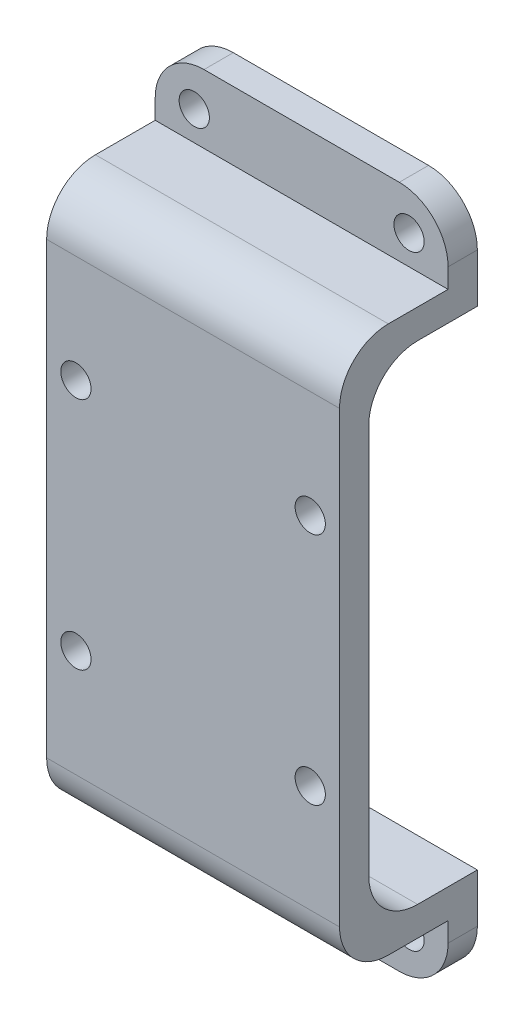
ISO-10303-21;
HEADER;
FILE_DESCRIPTION(('STEP AP214'),'2;1');
FILE_NAME('part.step','',(''),(''),'','','');
FILE_SCHEMA(('AUTOMOTIVE_DESIGN { 1 0 10303 214 1 1 1 1 }'));
ENDSEC;
DATA;
#1=APPLICATION_CONTEXT('core data for automotive mechanical design processes');
#2=APPLICATION_PROTOCOL_DEFINITION('international standard','automotive_design',2000,#1);
#3=PRODUCT_CONTEXT('',#1,'mechanical');
#4=PRODUCT('Part','Part','',(#3));
#5=PRODUCT_RELATED_PRODUCT_CATEGORY('part','',(#4));
#6=PRODUCT_DEFINITION_FORMATION('','',#4);
#7=PRODUCT_DEFINITION_CONTEXT('part definition',#1,'design');
#8=PRODUCT_DEFINITION('design','',#6,#7);
#9=PRODUCT_DEFINITION_SHAPE('','',#8);
#10=(LENGTH_UNIT() NAMED_UNIT(*) SI_UNIT(.MILLI.,.METRE.));
#11=(NAMED_UNIT(*) PLANE_ANGLE_UNIT() SI_UNIT($,.RADIAN.));
#12=(NAMED_UNIT(*) SI_UNIT($,.STERADIAN.) SOLID_ANGLE_UNIT());
#13=UNCERTAINTY_MEASURE_WITH_UNIT(LENGTH_MEASURE(1.E-05),#10,'distance_accuracy_value','');
#14=(GEOMETRIC_REPRESENTATION_CONTEXT(3) GLOBAL_UNCERTAINTY_ASSIGNED_CONTEXT((#13)) GLOBAL_UNIT_ASSIGNED_CONTEXT((#10,
#11,#12)) REPRESENTATION_CONTEXT('',''));
#15=CARTESIAN_POINT('',(0.,0.,0.));
#16=DIRECTION('',(0.,0.,1.));
#17=DIRECTION('',(1.,0.,0.));
#18=AXIS2_PLACEMENT_3D('',#15,#16,#17);
#19=CARTESIAN_POINT('',(0.,0.,22.24));
#20=DIRECTION('',(0.,0.,1.));
#21=DIRECTION('',(1.,0.,0.));
#22=AXIS2_PLACEMENT_3D('',#19,#20,#21);
#23=PLANE('',#22);
#24=CARTESIAN_POINT('',(57.8934978484899,-191.1,22.24));
#25=DIRECTION('',(0.,0.,1.));
#26=DIRECTION('',(1.,0.,0.));
#27=AXIS2_PLACEMENT_3D('',#24,#25,#26);
#28=CIRCLE('',#27,3.10000000000121);
#29=CARTESIAN_POINT('',(60.9934978484911,-191.1,22.24));
#30=VERTEX_POINT('',#29);
#31=EDGE_CURVE('E199',#30,#30,#28,.T.);
#32=ORIENTED_EDGE('',*,*,#31,.T.);
#33=EDGE_LOOP('',(#32));
#34=FACE_BOUND('',#33,.T.);
#35=CARTESIAN_POINT('',(105.89349784849,-191.1,22.24));
#36=DIRECTION('',(0.,0.,1.));
#37=DIRECTION('',(1.,0.,0.));
#38=AXIS2_PLACEMENT_3D('',#35,#36,#37);
#39=CIRCLE('',#38,3.10000000000119);
#40=CARTESIAN_POINT('',(108.993497848491,-191.1,22.24));
#41=VERTEX_POINT('',#40);
#42=EDGE_CURVE('E204',#41,#41,#39,.T.);
#43=ORIENTED_EDGE('',*,*,#42,.T.);
#44=EDGE_LOOP('',(#43));
#45=FACE_BOUND('',#44,.T.);
#46=CARTESIAN_POINT('',(105.89349784849,-143.1,22.24));
#47=DIRECTION('',(0.,0.,1.));
#48=DIRECTION('',(1.,0.,0.));
#49=AXIS2_PLACEMENT_3D('',#46,#47,#48);
#50=CIRCLE('',#49,3.10000000000181);
#51=CARTESIAN_POINT('',(108.993497848492,-143.1,22.24));
#52=VERTEX_POINT('',#51);
#53=EDGE_CURVE('E531',#52,#52,#50,.T.);
#54=ORIENTED_EDGE('',*,*,#53,.T.);
#55=EDGE_LOOP('',(#54));
#56=FACE_BOUND('',#55,.T.);
#57=CARTESIAN_POINT('',(57.8934978484897,-143.1,22.24));
#58=DIRECTION('',(0.,0.,1.));
#59=DIRECTION('',(1.,0.,0.));
#60=AXIS2_PLACEMENT_3D('',#57,#58,#59);
#61=CIRCLE('',#60,3.10000000000121);
#62=CARTESIAN_POINT('',(60.9934978484909,-143.1,22.24));
#63=VERTEX_POINT('',#62);
#64=EDGE_CURVE('E533',#63,#63,#61,.T.);
#65=ORIENTED_EDGE('',*,*,#64,.T.);
#66=EDGE_LOOP('',(#65));
#67=FACE_BOUND('',#66,.T.);
#68=DIRECTION('',(0.,-1.,0.));
#69=VECTOR('',#68,1.);
#70=CARTESIAN_POINT('',(51.8934978484892,-111.1,22.24));
#71=LINE('',#70,#69);
#72=CARTESIAN_POINT('',(51.8934978484892,-127.1,22.24));
#73=VERTEX_POINT('',#72);
#74=CARTESIAN_POINT('',(51.8934978484892,-207.1,22.24));
#75=VERTEX_POINT('',#74);
#76=EDGE_CURVE('E251',#73,#75,#71,.T.);
#77=ORIENTED_EDGE('',*,*,#76,.F.);
#78=DIRECTION('',(1.,0.,0.));
#79=VECTOR('',#78,1.);
#80=CARTESIAN_POINT('',(111.893497848489,-127.1,22.24));
#81=LINE('',#80,#79);
#82=CARTESIAN_POINT('',(111.893497848489,-127.1,22.24));
#83=VERTEX_POINT('',#82);
#84=EDGE_CURVE('E328',#73,#83,#81,.T.);
#85=ORIENTED_EDGE('',*,*,#84,.T.);
#86=DIRECTION('',(0.,1.,0.));
#87=VECTOR('',#86,1.);
#88=CARTESIAN_POINT('',(111.893497848489,-111.1,22.24));
#89=LINE('',#88,#87);
#90=CARTESIAN_POINT('',(111.893497848489,-207.1,22.24));
#91=VERTEX_POINT('',#90);
#92=EDGE_CURVE('E257',#91,#83,#89,.T.);
#93=ORIENTED_EDGE('',*,*,#92,.F.);
#94=DIRECTION('',(-1.,0.,0.));
#95=VECTOR('',#94,1.);
#96=CARTESIAN_POINT('',(51.8934978484892,-207.1,22.24));
#97=LINE('',#96,#95);
#98=EDGE_CURVE('E325',#91,#75,#97,.T.);
#99=ORIENTED_EDGE('',*,*,#98,.T.);
#100=EDGE_LOOP('',(#77,#85,#93,#99));
#101=FACE_BOUND('',#100,.T.);
#102=ADVANCED_FACE('F41',(#34,#45,#56,#67,#101),#23,.F.);
#103=CARTESIAN_POINT('',(61.8934978484892,-227.1,6.));
#104=DIRECTION('',(0.,0.,-1.));
#105=DIRECTION('',(-1.,0.,0.));
#106=AXIS2_PLACEMENT_3D('',#103,#104,#105);
#107=PLANE('',#106);
#108=CARTESIAN_POINT('',(103.893497848489,-229.1,6.));
#109=DIRECTION('',(0.,0.,1.));
#110=DIRECTION('',(1.,0.,0.));
#111=AXIS2_PLACEMENT_3D('',#108,#109,#110);
#112=CIRCLE('',#111,3.1);
#113=CARTESIAN_POINT('',(106.993497848489,-229.1,6.));
#114=VERTEX_POINT('',#113);
#115=EDGE_CURVE('E272',#114,#114,#112,.T.);
#116=ORIENTED_EDGE('',*,*,#115,.F.);
#117=EDGE_LOOP('',(#116));
#118=FACE_BOUND('',#117,.T.);
#119=CARTESIAN_POINT('',(59.8934978484892,-229.1,6.));
#120=DIRECTION('',(0.,0.,1.));
#121=DIRECTION('',(-1.,0.,0.));
#122=AXIS2_PLACEMENT_3D('',#119,#120,#121);
#123=CIRCLE('',#122,3.09999999999999);
#124=CARTESIAN_POINT('',(56.7934978484892,-229.1,6.));
#125=VERTEX_POINT('',#124);
#126=EDGE_CURVE('E278',#125,#125,#123,.T.);
#127=ORIENTED_EDGE('',*,*,#126,.F.);
#128=EDGE_LOOP('',(#127));
#129=FACE_BOUND('',#128,.T.);
#130=DIRECTION('',(1.,0.,0.));
#131=VECTOR('',#130,1.);
#132=CARTESIAN_POINT('',(51.8934978484892,-223.1,6.));
#133=LINE('',#132,#131);
#134=CARTESIAN_POINT('',(51.8934978484892,-223.1,6.));
#135=VERTEX_POINT('',#134);
#136=CARTESIAN_POINT('',(111.893497848489,-223.1,6.));
#137=VERTEX_POINT('',#136);
#138=EDGE_CURVE('E264',#135,#137,#133,.T.);
#139=ORIENTED_EDGE('',*,*,#138,.F.);
#140=DIRECTION('',(0.,-1.,0.));
#141=VECTOR('',#140,1.);
#142=CARTESIAN_POINT('',(51.8934978484892,-217.1,6.));
#143=LINE('',#142,#141);
#144=CARTESIAN_POINT('',(51.8934978484892,-227.1,6.));
#145=VERTEX_POINT('',#144);
#146=EDGE_CURVE('E284',#135,#145,#143,.T.);
#147=ORIENTED_EDGE('',*,*,#146,.T.);
#148=CARTESIAN_POINT('',(61.8934978484892,-227.1,6.));
#149=DIRECTION('',(0.,0.,1.));
#150=DIRECTION('',(-1.,0.,0.));
#151=AXIS2_PLACEMENT_3D('',#148,#149,#150);
#152=CIRCLE('',#151,9.99999999999999);
#153=CARTESIAN_POINT('',(61.8934978484892,-237.1,6.));
#154=VERTEX_POINT('',#153);
#155=EDGE_CURVE('E286',#145,#154,#152,.T.);
#156=ORIENTED_EDGE('',*,*,#155,.T.);
#157=DIRECTION('',(1.,0.,0.));
#158=VECTOR('',#157,1.);
#159=CARTESIAN_POINT('',(61.8934978484892,-237.1,6.));
#160=LINE('',#159,#158);
#161=CARTESIAN_POINT('',(101.893497848489,-237.1,6.));
#162=VERTEX_POINT('',#161);
#163=EDGE_CURVE('E289',#154,#162,#160,.T.);
#164=ORIENTED_EDGE('',*,*,#163,.T.);
#165=CARTESIAN_POINT('',(101.893497848489,-227.1,6.));
#166=DIRECTION('',(0.,0.,1.));
#167=DIRECTION('',(1.,0.,0.));
#168=AXIS2_PLACEMENT_3D('',#165,#166,#167);
#169=CIRCLE('',#168,9.99999999999999);
#170=CARTESIAN_POINT('',(111.893497848489,-227.1,6.));
#171=VERTEX_POINT('',#170);
#172=EDGE_CURVE('E291',#162,#171,#169,.T.);
#173=ORIENTED_EDGE('',*,*,#172,.T.);
#174=DIRECTION('',(0.,1.,0.));
#175=VECTOR('',#174,1.);
#176=CARTESIAN_POINT('',(111.893497848489,-217.1,6.));
#177=LINE('',#176,#175);
#178=EDGE_CURVE('E293',#171,#137,#177,.T.);
#179=ORIENTED_EDGE('',*,*,#178,.T.);
#180=EDGE_LOOP('',(#139,#147,#156,#164,#173,#179));
#181=FACE_BOUND('',#180,.T.);
#182=ADVANCED_FACE('F403',(#118,#129,#181),#107,.F.);
#183=CARTESIAN_POINT('',(61.8934978484892,-227.1,0.));
#184=DIRECTION('',(0.,0.,-1.));
#185=DIRECTION('',(-1.,0.,0.));
#186=AXIS2_PLACEMENT_3D('',#183,#184,#185);
#187=PLANE('',#186);
#188=CARTESIAN_POINT('',(59.8934978484892,-229.1,0.));
#189=DIRECTION('',(0.,0.,1.));
#190=DIRECTION('',(-1.,0.,0.));
#191=AXIS2_PLACEMENT_3D('',#188,#189,#190);
#192=CIRCLE('',#191,3.09999999999999);
#193=CARTESIAN_POINT('',(56.7934978484892,-229.1,0.));
#194=VERTEX_POINT('',#193);
#195=EDGE_CURVE('E275',#194,#194,#192,.T.);
#196=ORIENTED_EDGE('',*,*,#195,.T.);
#197=EDGE_LOOP('',(#196));
#198=FACE_BOUND('',#197,.T.);
#199=DIRECTION('',(0.,-1.,0.));
#200=VECTOR('',#199,1.);
#201=CARTESIAN_POINT('',(51.8934978484892,-217.1,0.));
#202=LINE('',#201,#200);
#203=CARTESIAN_POINT('',(51.8934978484892,-217.1,0.));
#204=VERTEX_POINT('',#203);
#205=CARTESIAN_POINT('',(51.8934978484892,-227.1,0.));
#206=VERTEX_POINT('',#205);
#207=EDGE_CURVE('E281',#204,#206,#202,.T.);
#208=ORIENTED_EDGE('',*,*,#207,.F.);
#209=DIRECTION('',(-1.,0.,0.));
#210=VECTOR('',#209,1.);
#211=CARTESIAN_POINT('',(51.8934978484892,-217.1,0.));
#212=LINE('',#211,#210);
#213=CARTESIAN_POINT('',(111.893497848489,-217.1,0.));
#214=VERTEX_POINT('',#213);
#215=EDGE_CURVE('E287',#214,#204,#212,.T.);
#216=ORIENTED_EDGE('',*,*,#215,.F.);
#217=DIRECTION('',(0.,1.,0.));
#218=VECTOR('',#217,1.);
#219=CARTESIAN_POINT('',(111.893497848489,-217.1,0.));
#220=LINE('',#219,#218);
#221=CARTESIAN_POINT('',(111.893497848489,-227.1,0.));
#222=VERTEX_POINT('',#221);
#223=EDGE_CURVE('E305',#222,#214,#220,.T.);
#224=ORIENTED_EDGE('',*,*,#223,.F.);
#225=CARTESIAN_POINT('',(101.893497848489,-227.1,0.));
#226=DIRECTION('',(0.,0.,1.));
#227=DIRECTION('',(1.,0.,0.));
#228=AXIS2_PLACEMENT_3D('',#225,#226,#227);
#229=CIRCLE('',#228,9.99999999999999);
#230=CARTESIAN_POINT('',(101.893497848489,-237.1,0.));
#231=VERTEX_POINT('',#230);
#232=EDGE_CURVE('E303',#231,#222,#229,.T.);
#233=ORIENTED_EDGE('',*,*,#232,.F.);
#234=DIRECTION('',(1.,0.,0.));
#235=VECTOR('',#234,1.);
#236=CARTESIAN_POINT('',(61.8934978484892,-237.1,0.));
#237=LINE('',#236,#235);
#238=CARTESIAN_POINT('',(61.8934978484892,-237.1,0.));
#239=VERTEX_POINT('',#238);
#240=EDGE_CURVE('E301',#239,#231,#237,.T.);
#241=ORIENTED_EDGE('',*,*,#240,.F.);
#242=CARTESIAN_POINT('',(61.8934978484892,-227.1,0.));
#243=DIRECTION('',(0.,0.,1.));
#244=DIRECTION('',(-1.,0.,0.));
#245=AXIS2_PLACEMENT_3D('',#242,#243,#244);
#246=CIRCLE('',#245,9.99999999999999);
#247=EDGE_CURVE('E299',#206,#239,#246,.T.);
#248=ORIENTED_EDGE('',*,*,#247,.F.);
#249=EDGE_LOOP('',(#208,#216,#224,#233,#241,#248));
#250=FACE_BOUND('',#249,.T.);
#251=CARTESIAN_POINT('',(103.893497848489,-229.1,0.));
#252=DIRECTION('',(0.,0.,1.));
#253=DIRECTION('',(1.,0.,0.));
#254=AXIS2_PLACEMENT_3D('',#251,#252,#253);
#255=CIRCLE('',#254,3.1);
#256=CARTESIAN_POINT('',(106.993497848489,-229.1,0.));
#257=VERTEX_POINT('',#256);
#258=EDGE_CURVE('E271',#257,#257,#255,.T.);
#259=ORIENTED_EDGE('',*,*,#258,.T.);
#260=EDGE_LOOP('',(#259));
#261=FACE_BOUND('',#260,.T.);
#262=ADVANCED_FACE('F424',(#198,#250,#261),#187,.T.);
#263=CARTESIAN_POINT('',(51.8934978484892,-217.1,6.));
#264=DIRECTION('',(1.,0.,0.));
#265=DIRECTION('',(0.,0.,-1.));
#266=AXIS2_PLACEMENT_3D('',#263,#264,#265);
#267=PLANE('',#266);
#268=DIRECTION('',(0.,0.,-1.));
#269=VECTOR('',#268,1.);
#270=CARTESIAN_POINT('',(51.8934978484892,-223.1,22.24));
#271=LINE('',#270,#269);
#272=CARTESIAN_POINT('',(51.8934978484892,-223.1,18.24));
#273=VERTEX_POINT('',#272);
#274=EDGE_CURVE('E269',#273,#135,#271,.T.);
#275=ORIENTED_EDGE('',*,*,#274,.F.);
#276=CARTESIAN_POINT('',(51.8934978484892,-213.1,18.24));
#277=DIRECTION('',(1.,0.,0.));
#278=DIRECTION('',(0.,0.,-1.));
#279=AXIS2_PLACEMENT_3D('',#276,#277,#278);
#280=CIRCLE('',#279,10.);
#281=CARTESIAN_POINT('',(51.8934978484892,-213.1,28.24));
#282=VERTEX_POINT('',#281);
#283=EDGE_CURVE('E346',#273,#282,#280,.F.);
#284=ORIENTED_EDGE('',*,*,#283,.T.);
#285=DIRECTION('',(0.,-1.,0.));
#286=VECTOR('',#285,1.);
#287=CARTESIAN_POINT('',(51.8934978484892,-111.1,28.24));
#288=LINE('',#287,#286);
#289=CARTESIAN_POINT('',(51.8934978484892,-121.1,28.24));
#290=VERTEX_POINT('',#289);
#291=EDGE_CURVE('E254',#290,#282,#288,.T.);
#292=ORIENTED_EDGE('',*,*,#291,.F.);
#293=CARTESIAN_POINT('',(51.8934978484892,-121.1,18.24));
#294=DIRECTION('',(1.,0.,0.));
#295=DIRECTION('',(0.,0.,-1.));
#296=AXIS2_PLACEMENT_3D('',#293,#294,#295);
#297=CIRCLE('',#296,10.);
#298=CARTESIAN_POINT('',(51.8934978484892,-111.1,18.24));
#299=VERTEX_POINT('',#298);
#300=EDGE_CURVE('E62',#290,#299,#297,.F.);
#301=ORIENTED_EDGE('',*,*,#300,.T.);
#302=DIRECTION('',(0.,0.,-1.));
#303=VECTOR('',#302,1.);
#304=CARTESIAN_POINT('',(51.8934978484892,-111.1,28.24));
#305=LINE('',#304,#303);
#306=CARTESIAN_POINT('',(51.8934978484892,-111.1,6.));
#307=VERTEX_POINT('',#306);
#308=EDGE_CURVE('E172',#299,#307,#305,.T.);
#309=ORIENTED_EDGE('',*,*,#308,.T.);
#310=DIRECTION('',(0.,-1.,0.));
#311=VECTOR('',#310,1.);
#312=CARTESIAN_POINT('',(51.8934978484892,-117.1,6.));
#313=LINE('',#312,#311);
#314=CARTESIAN_POINT('',(51.8934978484892,-107.1,6.));
#315=VERTEX_POINT('',#314);
#316=EDGE_CURVE('E177',#315,#307,#313,.T.);
#317=ORIENTED_EDGE('',*,*,#316,.F.);
#318=DIRECTION('',(0.,0.,-1.));
#319=VECTOR('',#318,1.);
#320=CARTESIAN_POINT('',(51.8934978484892,-107.1,6.));
#321=LINE('',#320,#319);
#322=CARTESIAN_POINT('',(51.8934978484892,-107.1,0.));
#323=VERTEX_POINT('',#322);
#324=EDGE_CURVE('E198',#315,#323,#321,.T.);
#325=ORIENTED_EDGE('',*,*,#324,.T.);
#326=DIRECTION('',(0.,-1.,0.));
#327=VECTOR('',#326,1.);
#328=CARTESIAN_POINT('',(51.8934978484892,-117.1,0.));
#329=LINE('',#328,#327);
#330=CARTESIAN_POINT('',(51.8934978484892,-117.1,0.));
#331=VERTEX_POINT('',#330);
#332=EDGE_CURVE('E230',#323,#331,#329,.T.);
#333=ORIENTED_EDGE('',*,*,#332,.T.);
#334=DIRECTION('',(0.,0.,-1.));
#335=VECTOR('',#334,1.);
#336=CARTESIAN_POINT('',(51.8934978484892,-117.1,6.));
#337=LINE('',#336,#335);
#338=CARTESIAN_POINT('',(51.8934978484892,-117.1,12.24));
#339=VERTEX_POINT('',#338);
#340=EDGE_CURVE('E201',#339,#331,#337,.T.);
#341=ORIENTED_EDGE('',*,*,#340,.F.);
#342=CARTESIAN_POINT('',(51.8934978484892,-127.1,12.24));
#343=DIRECTION('',(1.,0.,0.));
#344=DIRECTION('',(0.,0.,-1.));
#345=AXIS2_PLACEMENT_3D('',#342,#343,#344);
#346=CIRCLE('',#345,10.);
#347=EDGE_CURVE('E354',#339,#73,#346,.T.);
#348=ORIENTED_EDGE('',*,*,#347,.T.);
#349=ORIENTED_EDGE('',*,*,#76,.T.);
#350=CARTESIAN_POINT('',(51.8934978484892,-207.1,12.24));
#351=DIRECTION('',(1.,0.,0.));
#352=DIRECTION('',(0.,0.,-1.));
#353=AXIS2_PLACEMENT_3D('',#350,#351,#352);
#354=CIRCLE('',#353,10.);
#355=CARTESIAN_POINT('',(51.8934978484892,-217.1,12.24));
#356=VERTEX_POINT('',#355);
#357=EDGE_CURVE('E49',#75,#356,#354,.T.);
#358=ORIENTED_EDGE('',*,*,#357,.T.);
#359=DIRECTION('',(0.,0.,-1.));
#360=VECTOR('',#359,1.);
#361=CARTESIAN_POINT('',(51.8934978484892,-217.1,6.));
#362=LINE('',#361,#360);
#363=EDGE_CURVE('E296',#356,#204,#362,.T.);
#364=ORIENTED_EDGE('',*,*,#363,.T.);
#365=ORIENTED_EDGE('',*,*,#207,.T.);
#366=DIRECTION('',(0.,0.,-1.));
#367=VECTOR('',#366,1.);
#368=CARTESIAN_POINT('',(51.8934978484892,-227.1,6.));
#369=LINE('',#368,#367);
#370=EDGE_CURVE('E322',#145,#206,#369,.T.);
#371=ORIENTED_EDGE('',*,*,#370,.F.);
#372=ORIENTED_EDGE('',*,*,#146,.F.);
#373=EDGE_LOOP('',(#275,#284,#292,#301,#309,#317,#325,#333,#341,#348,#349,#358,#364,#365,#371,#372));
#374=FACE_BOUND('',#373,.T.);
#375=ADVANCED_FACE('F175',(#374),#267,.F.);
#376=CARTESIAN_POINT('',(61.8934978484892,-227.1,6.));
#377=DIRECTION('',(0.,0.,-1.));
#378=DIRECTION('',(-1.,0.,0.));
#379=AXIS2_PLACEMENT_3D('',#376,#377,#378);
#380=CYLINDRICAL_SURFACE('',#379,9.99999999999999);
#381=ORIENTED_EDGE('',*,*,#247,.T.);
#382=DIRECTION('',(0.,0.,-1.));
#383=VECTOR('',#382,1.);
#384=CARTESIAN_POINT('',(61.8934978484892,-237.1,6.));
#385=LINE('',#384,#383);
#386=EDGE_CURVE('E319',#154,#239,#385,.T.);
#387=ORIENTED_EDGE('',*,*,#386,.F.);
#388=ORIENTED_EDGE('',*,*,#155,.F.);
#389=ORIENTED_EDGE('',*,*,#370,.T.);
#390=EDGE_LOOP('',(#381,#387,#388,#389));
#391=FACE_BOUND('',#390,.T.);
#392=ADVANCED_FACE('F408',(#391),#380,.T.);
#393=CARTESIAN_POINT('',(61.8934978484892,-237.1,6.));
#394=DIRECTION('',(0.,1.,0.));
#395=DIRECTION('',(0.,0.,1.));
#396=AXIS2_PLACEMENT_3D('',#393,#394,#395);
#397=PLANE('',#396);
#398=ORIENTED_EDGE('',*,*,#240,.T.);
#399=DIRECTION('',(0.,0.,-1.));
#400=VECTOR('',#399,1.);
#401=CARTESIAN_POINT('',(101.893497848489,-237.1,6.));
#402=LINE('',#401,#400);
#403=EDGE_CURVE('E316',#162,#231,#402,.T.);
#404=ORIENTED_EDGE('',*,*,#403,.F.);
#405=ORIENTED_EDGE('',*,*,#163,.F.);
#406=ORIENTED_EDGE('',*,*,#386,.T.);
#407=EDGE_LOOP('',(#398,#404,#405,#406));
#408=FACE_BOUND('',#407,.T.);
#409=ADVANCED_FACE('F415',(#408),#397,.F.);
#410=CARTESIAN_POINT('',(101.893497848489,-227.1,6.));
#411=DIRECTION('',(0.,0.,-1.));
#412=DIRECTION('',(-1.,0.,0.));
#413=AXIS2_PLACEMENT_3D('',#410,#411,#412);
#414=CYLINDRICAL_SURFACE('',#413,9.99999999999999);
#415=ORIENTED_EDGE('',*,*,#232,.T.);
#416=DIRECTION('',(0.,0.,-1.));
#417=VECTOR('',#416,1.);
#418=CARTESIAN_POINT('',(111.893497848489,-227.1,6.));
#419=LINE('',#418,#417);
#420=EDGE_CURVE('E313',#171,#222,#419,.T.);
#421=ORIENTED_EDGE('',*,*,#420,.F.);
#422=ORIENTED_EDGE('',*,*,#172,.F.);
#423=ORIENTED_EDGE('',*,*,#403,.T.);
#424=EDGE_LOOP('',(#415,#421,#422,#423));
#425=FACE_BOUND('',#424,.T.);
#426=ADVANCED_FACE('F419',(#425),#414,.T.);
#427=CARTESIAN_POINT('',(111.893497848489,-217.1,6.));
#428=DIRECTION('',(-1.,0.,0.));
#429=DIRECTION('',(0.,0.,1.));
#430=AXIS2_PLACEMENT_3D('',#427,#428,#429);
#431=PLANE('',#430);
#432=DIRECTION('',(0.,1.,0.));
#433=VECTOR('',#432,1.);
#434=CARTESIAN_POINT('',(111.893497848489,-111.1,28.24));
#435=LINE('',#434,#433);
#436=CARTESIAN_POINT('',(111.893497848489,-213.1,28.24));
#437=VERTEX_POINT('',#436);
#438=CARTESIAN_POINT('',(111.893497848489,-121.1,28.24));
#439=VERTEX_POINT('',#438);
#440=EDGE_CURVE('E183',#437,#439,#435,.T.);
#441=ORIENTED_EDGE('',*,*,#440,.F.);
#442=CARTESIAN_POINT('',(111.893497848489,-213.1,18.24));
#443=DIRECTION('',(-1.,0.,0.));
#444=DIRECTION('',(0.,0.,1.));
#445=AXIS2_PLACEMENT_3D('',#442,#443,#444);
#446=CIRCLE('',#445,10.);
#447=CARTESIAN_POINT('',(111.893497848489,-223.1,18.24));
#448=VERTEX_POINT('',#447);
#449=EDGE_CURVE('E341',#437,#448,#446,.F.);
#450=ORIENTED_EDGE('',*,*,#449,.T.);
#451=DIRECTION('',(0.,0.,-1.));
#452=VECTOR('',#451,1.);
#453=CARTESIAN_POINT('',(111.893497848489,-223.1,22.24));
#454=LINE('',#453,#452);
#455=EDGE_CURVE('E267',#448,#137,#454,.T.);
#456=ORIENTED_EDGE('',*,*,#455,.T.);
#457=ORIENTED_EDGE('',*,*,#178,.F.);
#458=ORIENTED_EDGE('',*,*,#420,.T.);
#459=ORIENTED_EDGE('',*,*,#223,.T.);
#460=DIRECTION('',(0.,0.,-1.));
#461=VECTOR('',#460,1.);
#462=CARTESIAN_POINT('',(111.893497848489,-217.1,6.));
#463=LINE('',#462,#461);
#464=CARTESIAN_POINT('',(111.893497848489,-217.1,12.24));
#465=VERTEX_POINT('',#464);
#466=EDGE_CURVE('E311',#465,#214,#463,.T.);
#467=ORIENTED_EDGE('',*,*,#466,.F.);
#468=CARTESIAN_POINT('',(111.893497848489,-207.1,12.24));
#469=DIRECTION('',(-1.,0.,0.));
#470=DIRECTION('',(0.,0.,1.));
#471=AXIS2_PLACEMENT_3D('',#468,#469,#470);
#472=CIRCLE('',#471,10.);
#473=EDGE_CURVE('E11',#465,#91,#472,.T.);
#474=ORIENTED_EDGE('',*,*,#473,.T.);
#475=ORIENTED_EDGE('',*,*,#92,.T.);
#476=CARTESIAN_POINT('',(111.893497848489,-127.1,12.24));
#477=DIRECTION('',(-1.,0.,0.));
#478=DIRECTION('',(0.,0.,1.));
#479=AXIS2_PLACEMENT_3D('',#476,#477,#478);
#480=CIRCLE('',#479,10.);
#481=CARTESIAN_POINT('',(111.893497848489,-117.1,12.24));
#482=VERTEX_POINT('',#481);
#483=EDGE_CURVE('E352',#83,#482,#480,.T.);
#484=ORIENTED_EDGE('',*,*,#483,.T.);
#485=DIRECTION('',(0.,0.,-1.));
#486=VECTOR('',#485,1.);
#487=CARTESIAN_POINT('',(111.893497848489,-117.1,6.));
#488=LINE('',#487,#486);
#489=CARTESIAN_POINT('',(111.893497848489,-117.1,0.));
#490=VERTEX_POINT('',#489);
#491=EDGE_CURVE('E209',#482,#490,#488,.T.);
#492=ORIENTED_EDGE('',*,*,#491,.T.);
#493=DIRECTION('',(0.,1.,0.));
#494=VECTOR('',#493,1.);
#495=CARTESIAN_POINT('',(111.893497848489,-117.1,0.));
#496=LINE('',#495,#494);
#497=CARTESIAN_POINT('',(111.893497848489,-107.1,0.));
#498=VERTEX_POINT('',#497);
#499=EDGE_CURVE('E225',#490,#498,#496,.T.);
#500=ORIENTED_EDGE('',*,*,#499,.T.);
#501=DIRECTION('',(0.,0.,-1.));
#502=VECTOR('',#501,1.);
#503=CARTESIAN_POINT('',(111.893497848489,-107.1,6.));
#504=LINE('',#503,#502);
#505=CARTESIAN_POINT('',(111.893497848489,-107.1,6.));
#506=VERTEX_POINT('',#505);
#507=EDGE_CURVE('E211',#506,#498,#504,.T.);
#508=ORIENTED_EDGE('',*,*,#507,.F.);
#509=DIRECTION('',(0.,1.,0.));
#510=VECTOR('',#509,1.);
#511=CARTESIAN_POINT('',(111.893497848489,-117.1,6.));
#512=LINE('',#511,#510);
#513=CARTESIAN_POINT('',(111.893497848489,-111.1,6.));
#514=VERTEX_POINT('',#513);
#515=EDGE_CURVE('E194',#514,#506,#512,.T.);
#516=ORIENTED_EDGE('',*,*,#515,.F.);
#517=DIRECTION('',(0.,0.,-1.));
#518=VECTOR('',#517,1.);
#519=CARTESIAN_POINT('',(111.893497848489,-111.1,28.24));
#520=LINE('',#519,#518);
#521=CARTESIAN_POINT('',(111.893497848489,-111.1,18.24));
#522=VERTEX_POINT('',#521);
#523=EDGE_CURVE('E182',#522,#514,#520,.T.);
#524=ORIENTED_EDGE('',*,*,#523,.F.);
#525=CARTESIAN_POINT('',(111.893497848489,-121.1,18.24));
#526=DIRECTION('',(-1.,0.,0.));
#527=DIRECTION('',(0.,0.,1.));
#528=AXIS2_PLACEMENT_3D('',#525,#526,#527);
#529=CIRCLE('',#528,10.);
#530=EDGE_CURVE('E339',#522,#439,#529,.F.);
#531=ORIENTED_EDGE('',*,*,#530,.T.);
#532=EDGE_LOOP('',(#441,#450,#456,#457,#458,#459,#467,#474,#475,#484,#492,#500,#508,#516,#524,#531));
#533=FACE_BOUND('',#532,.T.);
#534=ADVANCED_FACE('F368',(#533),#431,.F.);
#535=CARTESIAN_POINT('',(51.8934978484892,-217.1,6.));
#536=DIRECTION('',(0.,-1.,0.));
#537=DIRECTION('',(0.,0.,-1.));
#538=AXIS2_PLACEMENT_3D('',#535,#536,#537);
#539=PLANE('',#538);
#540=ORIENTED_EDGE('',*,*,#363,.F.);
#541=DIRECTION('',(-1.,0.,0.));
#542=VECTOR('',#541,1.);
#543=CARTESIAN_POINT('',(111.893497848489,-217.1,12.24));
#544=LINE('',#543,#542);
#545=EDGE_CURVE('E348',#356,#465,#544,.F.);
#546=ORIENTED_EDGE('',*,*,#545,.T.);
#547=ORIENTED_EDGE('',*,*,#466,.T.);
#548=ORIENTED_EDGE('',*,*,#215,.T.);
#549=EDGE_LOOP('',(#540,#546,#547,#548));
#550=FACE_BOUND('',#549,.T.);
#551=ADVANCED_FACE('F427',(#550),#539,.F.);
#552=CARTESIAN_POINT('',(59.8934978484892,-229.1,6.));
#553=DIRECTION('',(0.,0.,-1.));
#554=DIRECTION('',(-1.,0.,0.));
#555=AXIS2_PLACEMENT_3D('',#552,#553,#554);
#556=CYLINDRICAL_SURFACE('',#555,3.09999999999999);
#557=ORIENTED_EDGE('',*,*,#126,.T.);
#558=EDGE_LOOP('',(#557));
#559=FACE_BOUND('',#558,.T.);
#560=ORIENTED_EDGE('',*,*,#195,.F.);
#561=EDGE_LOOP('',(#560));
#562=FACE_BOUND('',#561,.T.);
#563=ADVANCED_FACE('F459',(#559,#562),#556,.F.);
#564=CARTESIAN_POINT('',(103.893497848489,-229.1,6.));
#565=DIRECTION('',(0.,0.,-1.));
#566=DIRECTION('',(-1.,0.,0.));
#567=AXIS2_PLACEMENT_3D('',#564,#565,#566);
#568=CYLINDRICAL_SURFACE('',#567,3.1);
#569=ORIENTED_EDGE('',*,*,#115,.T.);
#570=EDGE_LOOP('',(#569));
#571=FACE_BOUND('',#570,.T.);
#572=ORIENTED_EDGE('',*,*,#258,.F.);
#573=EDGE_LOOP('',(#572));
#574=FACE_BOUND('',#573,.T.);
#575=ADVANCED_FACE('F456',(#571,#574),#568,.F.);
#576=CARTESIAN_POINT('',(51.8934978484892,-223.1,22.24));
#577=DIRECTION('',(0.,1.,0.));
#578=DIRECTION('',(0.,0.,1.));
#579=AXIS2_PLACEMENT_3D('',#576,#577,#578);
#580=PLANE('',#579);
#581=ORIENTED_EDGE('',*,*,#455,.F.);
#582=DIRECTION('',(1.,0.,0.));
#583=VECTOR('',#582,1.);
#584=CARTESIAN_POINT('',(51.8934978484892,-223.1,18.24));
#585=LINE('',#584,#583);
#586=EDGE_CURVE('E343',#448,#273,#585,.F.);
#587=ORIENTED_EDGE('',*,*,#586,.T.);
#588=ORIENTED_EDGE('',*,*,#274,.T.);
#589=ORIENTED_EDGE('',*,*,#138,.T.);
#590=EDGE_LOOP('',(#581,#587,#588,#589));
#591=FACE_BOUND('',#590,.T.);
#592=ADVANCED_FACE('F400',(#591),#580,.F.);
#593=CARTESIAN_POINT('',(51.8934978484892,-111.1,28.24));
#594=DIRECTION('',(0.,-1.,0.));
#595=DIRECTION('',(0.,0.,-1.));
#596=AXIS2_PLACEMENT_3D('',#593,#594,#595);
#597=PLANE('',#596);
#598=ORIENTED_EDGE('',*,*,#308,.F.);
#599=DIRECTION('',(-1.,0.,0.));
#600=VECTOR('',#599,1.);
#601=CARTESIAN_POINT('',(111.893497848489,-111.1,18.24));
#602=LINE('',#601,#600);
#603=EDGE_CURVE('E350',#299,#522,#602,.F.);
#604=ORIENTED_EDGE('',*,*,#603,.T.);
#605=ORIENTED_EDGE('',*,*,#523,.T.);
#606=DIRECTION('',(-1.,0.,0.));
#607=VECTOR('',#606,1.);
#608=CARTESIAN_POINT('',(51.8934978484892,-111.1,6.));
#609=LINE('',#608,#607);
#610=EDGE_CURVE('E189',#514,#307,#609,.T.);
#611=ORIENTED_EDGE('',*,*,#610,.T.);
#612=EDGE_LOOP('',(#598,#604,#605,#611));
#613=FACE_BOUND('',#612,.T.);
#614=ADVANCED_FACE('F196',(#613),#597,.F.);
#615=CARTESIAN_POINT('',(0.,0.,28.24));
#616=DIRECTION('',(0.,0.,1.));
#617=DIRECTION('',(1.,0.,0.));
#618=AXIS2_PLACEMENT_3D('',#615,#616,#617);
#619=PLANE('',#618);
#620=CARTESIAN_POINT('',(57.8934978484899,-191.1,28.24));
#621=DIRECTION('',(0.,0.,1.));
#622=DIRECTION('',(1.,0.,0.));
#623=AXIS2_PLACEMENT_3D('',#620,#621,#622);
#624=CIRCLE('',#623,3.10000000000121);
#625=CARTESIAN_POINT('',(60.9934978484911,-191.1,28.24));
#626=VERTEX_POINT('',#625);
#627=EDGE_CURVE('E542',#626,#626,#624,.T.);
#628=ORIENTED_EDGE('',*,*,#627,.F.);
#629=EDGE_LOOP('',(#628));
#630=FACE_BOUND('',#629,.T.);
#631=CARTESIAN_POINT('',(105.89349784849,-191.1,28.24));
#632=DIRECTION('',(0.,0.,1.));
#633=DIRECTION('',(1.,0.,0.));
#634=AXIS2_PLACEMENT_3D('',#631,#632,#633);
#635=CIRCLE('',#634,3.10000000000119);
#636=CARTESIAN_POINT('',(108.993497848491,-191.1,28.24));
#637=VERTEX_POINT('',#636);
#638=EDGE_CURVE('E545',#637,#637,#635,.T.);
#639=ORIENTED_EDGE('',*,*,#638,.F.);
#640=EDGE_LOOP('',(#639));
#641=FACE_BOUND('',#640,.T.);
#642=CARTESIAN_POINT('',(105.89349784849,-143.1,28.24));
#643=DIRECTION('',(0.,0.,1.));
#644=DIRECTION('',(1.,0.,0.));
#645=AXIS2_PLACEMENT_3D('',#642,#643,#644);
#646=CIRCLE('',#645,3.10000000000181);
#647=CARTESIAN_POINT('',(108.993497848492,-143.1,28.24));
#648=VERTEX_POINT('',#647);
#649=EDGE_CURVE('E528',#648,#648,#646,.T.);
#650=ORIENTED_EDGE('',*,*,#649,.F.);
#651=EDGE_LOOP('',(#650));
#652=FACE_BOUND('',#651,.T.);
#653=CARTESIAN_POINT('',(57.8934978484897,-143.1,28.24));
#654=DIRECTION('',(0.,0.,1.));
#655=DIRECTION('',(1.,0.,0.));
#656=AXIS2_PLACEMENT_3D('',#653,#654,#655);
#657=CIRCLE('',#656,3.10000000000121);
#658=CARTESIAN_POINT('',(60.9934978484909,-143.1,28.24));
#659=VERTEX_POINT('',#658);
#660=EDGE_CURVE('E537',#659,#659,#657,.T.);
#661=ORIENTED_EDGE('',*,*,#660,.F.);
#662=EDGE_LOOP('',(#661));
#663=FACE_BOUND('',#662,.T.);
#664=ORIENTED_EDGE('',*,*,#291,.T.);
#665=DIRECTION('',(1.,0.,0.));
#666=VECTOR('',#665,1.);
#667=CARTESIAN_POINT('',(111.893497848489,-213.1,28.24));
#668=LINE('',#667,#666);
#669=EDGE_CURVE('E336',#282,#437,#668,.T.);
#670=ORIENTED_EDGE('',*,*,#669,.T.);
#671=ORIENTED_EDGE('',*,*,#440,.T.);
#672=DIRECTION('',(-1.,0.,0.));
#673=VECTOR('',#672,1.);
#674=CARTESIAN_POINT('',(51.8934978484892,-121.1,28.24));
#675=LINE('',#674,#673);
#676=EDGE_CURVE('E333',#439,#290,#675,.T.);
#677=ORIENTED_EDGE('',*,*,#676,.T.);
#678=EDGE_LOOP('',(#664,#670,#671,#677));
#679=FACE_BOUND('',#678,.T.);
#680=ADVANCED_FACE('F390',(#630,#641,#652,#663,#679),#619,.T.);
#681=CARTESIAN_POINT('',(61.8934978484892,-107.1,6.));
#682=DIRECTION('',(0.,0.,1.));
#683=DIRECTION('',(1.,0.,0.));
#684=AXIS2_PLACEMENT_3D('',#681,#682,#683);
#685=PLANE('',#684);
#686=ORIENTED_EDGE('',*,*,#610,.F.);
#687=ORIENTED_EDGE('',*,*,#515,.T.);
#688=CARTESIAN_POINT('',(101.893497848489,-107.1,6.));
#689=DIRECTION('',(0.,0.,1.));
#690=DIRECTION('',(-1.,0.,0.));
#691=AXIS2_PLACEMENT_3D('',#688,#689,#690);
#692=CIRCLE('',#691,9.99999999999999);
#693=CARTESIAN_POINT('',(101.893497848489,-97.1,6.));
#694=VERTEX_POINT('',#693);
#695=EDGE_CURVE('E238',#506,#694,#692,.T.);
#696=ORIENTED_EDGE('',*,*,#695,.T.);
#697=DIRECTION('',(-1.,0.,0.));
#698=VECTOR('',#697,1.);
#699=CARTESIAN_POINT('',(61.8934978484892,-97.1,6.));
#700=LINE('',#699,#698);
#701=CARTESIAN_POINT('',(61.8934978484892,-97.1,6.));
#702=VERTEX_POINT('',#701);
#703=EDGE_CURVE('E220',#694,#702,#700,.T.);
#704=ORIENTED_EDGE('',*,*,#703,.T.);
#705=CARTESIAN_POINT('',(61.8934978484892,-107.1,6.));
#706=DIRECTION('',(0.,0.,1.));
#707=DIRECTION('',(1.,0.,0.));
#708=AXIS2_PLACEMENT_3D('',#705,#706,#707);
#709=CIRCLE('',#708,9.99999999999999);
#710=EDGE_CURVE('E192',#702,#315,#709,.T.);
#711=ORIENTED_EDGE('',*,*,#710,.T.);
#712=ORIENTED_EDGE('',*,*,#316,.T.);
#713=EDGE_LOOP('',(#686,#687,#696,#704,#711,#712));
#714=FACE_BOUND('',#713,.T.);
#715=CARTESIAN_POINT('',(59.8934978484892,-105.1,6.));
#716=DIRECTION('',(0.,0.,1.));
#717=DIRECTION('',(1.,0.,0.));
#718=AXIS2_PLACEMENT_3D('',#715,#716,#717);
#719=CIRCLE('',#718,3.1);
#720=CARTESIAN_POINT('',(62.9934978484892,-105.1,6.));
#721=VERTEX_POINT('',#720);
#722=EDGE_CURVE('E236',#721,#721,#719,.T.);
#723=ORIENTED_EDGE('',*,*,#722,.F.);
#724=EDGE_LOOP('',(#723));
#725=FACE_BOUND('',#724,.T.);
#726=CARTESIAN_POINT('',(103.893497848489,-105.1,6.));
#727=DIRECTION('',(0.,0.,1.));
#728=DIRECTION('',(-1.,0.,0.));
#729=AXIS2_PLACEMENT_3D('',#726,#727,#728);
#730=CIRCLE('',#729,3.1);
#731=CARTESIAN_POINT('',(100.793497848489,-105.1,6.));
#732=VERTEX_POINT('',#731);
#733=EDGE_CURVE('E245',#732,#732,#730,.T.);
#734=ORIENTED_EDGE('',*,*,#733,.F.);
#735=EDGE_LOOP('',(#734));
#736=FACE_BOUND('',#735,.T.);
#737=ADVANCED_FACE('F187',(#714,#725,#736),#685,.T.);
#738=CARTESIAN_POINT('',(61.8934978484892,-107.1,0.));
#739=DIRECTION('',(0.,0.,1.));
#740=DIRECTION('',(1.,0.,0.));
#741=AXIS2_PLACEMENT_3D('',#738,#739,#740);
#742=PLANE('',#741);
#743=CARTESIAN_POINT('',(61.8934978484892,-107.1,0.));
#744=DIRECTION('',(0.,0.,1.));
#745=DIRECTION('',(1.,0.,0.));
#746=AXIS2_PLACEMENT_3D('',#743,#744,#745);
#747=CIRCLE('',#746,9.99999999999999);
#748=CARTESIAN_POINT('',(61.8934978484892,-97.1,0.));
#749=VERTEX_POINT('',#748);
#750=EDGE_CURVE('E233',#749,#323,#747,.T.);
#751=ORIENTED_EDGE('',*,*,#750,.F.);
#752=DIRECTION('',(-1.,0.,0.));
#753=VECTOR('',#752,1.);
#754=CARTESIAN_POINT('',(61.8934978484892,-97.1,0.));
#755=LINE('',#754,#753);
#756=CARTESIAN_POINT('',(101.893497848489,-97.1,0.));
#757=VERTEX_POINT('',#756);
#758=EDGE_CURVE('E221',#757,#749,#755,.T.);
#759=ORIENTED_EDGE('',*,*,#758,.F.);
#760=CARTESIAN_POINT('',(101.893497848489,-107.1,0.));
#761=DIRECTION('',(0.,0.,1.));
#762=DIRECTION('',(-1.,0.,0.));
#763=AXIS2_PLACEMENT_3D('',#760,#761,#762);
#764=CIRCLE('',#763,9.99999999999999);
#765=EDGE_CURVE('E223',#498,#757,#764,.T.);
#766=ORIENTED_EDGE('',*,*,#765,.F.);
#767=ORIENTED_EDGE('',*,*,#499,.F.);
#768=DIRECTION('',(1.,0.,0.));
#769=VECTOR('',#768,1.);
#770=CARTESIAN_POINT('',(51.8934978484892,-117.1,0.));
#771=LINE('',#770,#769);
#772=EDGE_CURVE('E227',#331,#490,#771,.T.);
#773=ORIENTED_EDGE('',*,*,#772,.F.);
#774=ORIENTED_EDGE('',*,*,#332,.F.);
#775=EDGE_LOOP('',(#751,#759,#766,#767,#773,#774));
#776=FACE_BOUND('',#775,.T.);
#777=CARTESIAN_POINT('',(59.8934978484892,-105.1,0.));
#778=DIRECTION('',(0.,0.,1.));
#779=DIRECTION('',(1.,0.,0.));
#780=AXIS2_PLACEMENT_3D('',#777,#778,#779);
#781=CIRCLE('',#780,3.1);
#782=CARTESIAN_POINT('',(62.9934978484892,-105.1,0.));
#783=VERTEX_POINT('',#782);
#784=EDGE_CURVE('E242',#783,#783,#781,.T.);
#785=ORIENTED_EDGE('',*,*,#784,.T.);
#786=EDGE_LOOP('',(#785));
#787=FACE_BOUND('',#786,.T.);
#788=CARTESIAN_POINT('',(103.893497848489,-105.1,0.));
#789=DIRECTION('',(0.,0.,1.));
#790=DIRECTION('',(-1.,0.,0.));
#791=AXIS2_PLACEMENT_3D('',#788,#789,#790);
#792=CIRCLE('',#791,3.1);
#793=CARTESIAN_POINT('',(100.793497848489,-105.1,0.));
#794=VERTEX_POINT('',#793);
#795=EDGE_CURVE('E248',#794,#794,#792,.T.);
#796=ORIENTED_EDGE('',*,*,#795,.T.);
#797=EDGE_LOOP('',(#796));
#798=FACE_BOUND('',#797,.T.);
#799=ADVANCED_FACE('F376',(#776,#787,#798),#742,.F.);
#800=CARTESIAN_POINT('',(61.8934978484892,-107.1,6.));
#801=DIRECTION('',(0.,0.,-1.));
#802=DIRECTION('',(-1.,0.,0.));
#803=AXIS2_PLACEMENT_3D('',#800,#801,#802);
#804=CYLINDRICAL_SURFACE('',#803,9.99999999999999);
#805=ORIENTED_EDGE('',*,*,#750,.T.);
#806=ORIENTED_EDGE('',*,*,#324,.F.);
#807=ORIENTED_EDGE('',*,*,#710,.F.);
#808=DIRECTION('',(0.,0.,-1.));
#809=VECTOR('',#808,1.);
#810=CARTESIAN_POINT('',(61.8934978484892,-97.1,6.));
#811=LINE('',#810,#809);
#812=EDGE_CURVE('E217',#702,#749,#811,.T.);
#813=ORIENTED_EDGE('',*,*,#812,.T.);
#814=EDGE_LOOP('',(#805,#806,#807,#813));
#815=FACE_BOUND('',#814,.T.);
#816=ADVANCED_FACE('F499',(#815),#804,.T.);
#817=CARTESIAN_POINT('',(51.8934978484892,-117.1,6.));
#818=DIRECTION('',(0.,1.,0.));
#819=DIRECTION('',(0.,0.,1.));
#820=AXIS2_PLACEMENT_3D('',#817,#818,#819);
#821=PLANE('',#820);
#822=ORIENTED_EDGE('',*,*,#491,.F.);
#823=DIRECTION('',(1.,0.,0.));
#824=VECTOR('',#823,1.);
#825=CARTESIAN_POINT('',(51.8934978484892,-117.1,12.24));
#826=LINE('',#825,#824);
#827=EDGE_CURVE('E331',#482,#339,#826,.F.);
#828=ORIENTED_EDGE('',*,*,#827,.T.);
#829=ORIENTED_EDGE('',*,*,#340,.T.);
#830=ORIENTED_EDGE('',*,*,#772,.T.);
#831=EDGE_LOOP('',(#822,#828,#829,#830));
#832=FACE_BOUND('',#831,.T.);
#833=ADVANCED_FACE('F370',(#832),#821,.F.);
#834=CARTESIAN_POINT('',(101.893497848489,-107.1,6.));
#835=DIRECTION('',(0.,0.,-1.));
#836=DIRECTION('',(-1.,0.,0.));
#837=AXIS2_PLACEMENT_3D('',#834,#835,#836);
#838=CYLINDRICAL_SURFACE('',#837,9.99999999999999);
#839=ORIENTED_EDGE('',*,*,#765,.T.);
#840=DIRECTION('',(0.,0.,-1.));
#841=VECTOR('',#840,1.);
#842=CARTESIAN_POINT('',(101.893497848489,-97.1,6.));
#843=LINE('',#842,#841);
#844=EDGE_CURVE('E214',#694,#757,#843,.T.);
#845=ORIENTED_EDGE('',*,*,#844,.F.);
#846=ORIENTED_EDGE('',*,*,#695,.F.);
#847=ORIENTED_EDGE('',*,*,#507,.T.);
#848=EDGE_LOOP('',(#839,#845,#846,#847));
#849=FACE_BOUND('',#848,.T.);
#850=ADVANCED_FACE('F382',(#849),#838,.T.);
#851=CARTESIAN_POINT('',(61.8934978484892,-97.1,6.));
#852=DIRECTION('',(0.,-1.,0.));
#853=DIRECTION('',(0.,0.,-1.));
#854=AXIS2_PLACEMENT_3D('',#851,#852,#853);
#855=PLANE('',#854);
#856=ORIENTED_EDGE('',*,*,#758,.T.);
#857=ORIENTED_EDGE('',*,*,#812,.F.);
#858=ORIENTED_EDGE('',*,*,#703,.F.);
#859=ORIENTED_EDGE('',*,*,#844,.T.);
#860=EDGE_LOOP('',(#856,#857,#858,#859));
#861=FACE_BOUND('',#860,.T.);
#862=ADVANCED_FACE('F490',(#861),#855,.F.);
#863=CARTESIAN_POINT('',(59.8934978484892,-105.1,6.));
#864=DIRECTION('',(0.,0.,-1.));
#865=DIRECTION('',(-1.,0.,0.));
#866=AXIS2_PLACEMENT_3D('',#863,#864,#865);
#867=CYLINDRICAL_SURFACE('',#866,3.1);
#868=ORIENTED_EDGE('',*,*,#722,.T.);
#869=EDGE_LOOP('',(#868));
#870=FACE_BOUND('',#869,.T.);
#871=ORIENTED_EDGE('',*,*,#784,.F.);
#872=EDGE_LOOP('',(#871));
#873=FACE_BOUND('',#872,.T.);
#874=ADVANCED_FACE('F485',(#870,#873),#867,.F.);
#875=CARTESIAN_POINT('',(103.893497848489,-105.1,6.));
#876=DIRECTION('',(0.,0.,-1.));
#877=DIRECTION('',(-1.,0.,0.));
#878=AXIS2_PLACEMENT_3D('',#875,#876,#877);
#879=CYLINDRICAL_SURFACE('',#878,3.1);
#880=ORIENTED_EDGE('',*,*,#733,.T.);
#881=EDGE_LOOP('',(#880));
#882=FACE_BOUND('',#881,.T.);
#883=ORIENTED_EDGE('',*,*,#795,.F.);
#884=EDGE_LOOP('',(#883));
#885=FACE_BOUND('',#884,.T.);
#886=ADVANCED_FACE('F480',(#882,#885),#879,.F.);
#887=CARTESIAN_POINT('',(0.,-127.1,12.24));
#888=DIRECTION('',(-1.,0.,0.));
#889=DIRECTION('',(0.,0.,1.));
#890=AXIS2_PLACEMENT_3D('',#887,#888,#889);
#891=CYLINDRICAL_SURFACE('',#890,10.);
#892=ORIENTED_EDGE('',*,*,#347,.F.);
#893=ORIENTED_EDGE('',*,*,#827,.F.);
#894=ORIENTED_EDGE('',*,*,#483,.F.);
#895=ORIENTED_EDGE('',*,*,#84,.F.);
#896=EDGE_LOOP('',(#892,#893,#894,#895));
#897=FACE_BOUND('',#896,.T.);
#898=ADVANCED_FACE('F364',(#897),#891,.F.);
#899=CARTESIAN_POINT('',(0.,-213.1,18.24));
#900=DIRECTION('',(-1.,0.,0.));
#901=DIRECTION('',(0.,0.,1.));
#902=AXIS2_PLACEMENT_3D('',#899,#900,#901);
#903=CYLINDRICAL_SURFACE('',#902,10.);
#904=ORIENTED_EDGE('',*,*,#283,.F.);
#905=ORIENTED_EDGE('',*,*,#586,.F.);
#906=ORIENTED_EDGE('',*,*,#449,.F.);
#907=ORIENTED_EDGE('',*,*,#669,.F.);
#908=EDGE_LOOP('',(#904,#905,#906,#907));
#909=FACE_BOUND('',#908,.T.);
#910=ADVANCED_FACE('F396',(#909),#903,.T.);
#911=CARTESIAN_POINT('',(0.,-207.1,12.24));
#912=DIRECTION('',(1.,0.,0.));
#913=DIRECTION('',(0.,0.,-1.));
#914=AXIS2_PLACEMENT_3D('',#911,#912,#913);
#915=CYLINDRICAL_SURFACE('',#914,10.);
#916=ORIENTED_EDGE('',*,*,#473,.F.);
#917=ORIENTED_EDGE('',*,*,#545,.F.);
#918=ORIENTED_EDGE('',*,*,#357,.F.);
#919=ORIENTED_EDGE('',*,*,#98,.F.);
#920=EDGE_LOOP('',(#916,#917,#918,#919));
#921=FACE_BOUND('',#920,.T.);
#922=ADVANCED_FACE('F431',(#921),#915,.F.);
#923=CARTESIAN_POINT('',(0.,-121.1,18.24));
#924=DIRECTION('',(1.,0.,0.));
#925=DIRECTION('',(0.,0.,-1.));
#926=AXIS2_PLACEMENT_3D('',#923,#924,#925);
#927=CYLINDRICAL_SURFACE('',#926,10.);
#928=ORIENTED_EDGE('',*,*,#530,.F.);
#929=ORIENTED_EDGE('',*,*,#603,.F.);
#930=ORIENTED_EDGE('',*,*,#300,.F.);
#931=ORIENTED_EDGE('',*,*,#676,.F.);
#932=EDGE_LOOP('',(#928,#929,#930,#931));
#933=FACE_BOUND('',#932,.T.);
#934=ADVANCED_FACE('F43',(#933),#927,.T.);
#935=CARTESIAN_POINT('',(57.8934978484897,-143.1,0.));
#936=DIRECTION('',(0.,0.,1.));
#937=DIRECTION('',(1.,0.,0.));
#938=AXIS2_PLACEMENT_3D('',#935,#936,#937);
#939=CYLINDRICAL_SURFACE('',#938,3.10000000000121);
#940=ORIENTED_EDGE('',*,*,#660,.T.);
#941=EDGE_LOOP('',(#940));
#942=FACE_BOUND('',#941,.T.);
#943=ORIENTED_EDGE('',*,*,#64,.F.);
#944=EDGE_LOOP('',(#943));
#945=FACE_BOUND('',#944,.T.);
#946=ADVANCED_FACE('F437',(#942,#945),#939,.F.);
#947=CARTESIAN_POINT('',(105.89349784849,-143.1,0.));
#948=DIRECTION('',(0.,0.,1.));
#949=DIRECTION('',(1.,0.,0.));
#950=AXIS2_PLACEMENT_3D('',#947,#948,#949);
#951=CYLINDRICAL_SURFACE('',#950,3.10000000000181);
#952=ORIENTED_EDGE('',*,*,#649,.T.);
#953=EDGE_LOOP('',(#952));
#954=FACE_BOUND('',#953,.T.);
#955=ORIENTED_EDGE('',*,*,#53,.F.);
#956=EDGE_LOOP('',(#955));
#957=FACE_BOUND('',#956,.T.);
#958=ADVANCED_FACE('F511',(#954,#957),#951,.F.);
#959=CARTESIAN_POINT('',(105.89349784849,-191.1,0.));
#960=DIRECTION('',(0.,0.,1.));
#961=DIRECTION('',(1.,0.,0.));
#962=AXIS2_PLACEMENT_3D('',#959,#960,#961);
#963=CYLINDRICAL_SURFACE('',#962,3.10000000000119);
#964=ORIENTED_EDGE('',*,*,#638,.T.);
#965=EDGE_LOOP('',(#964));
#966=FACE_BOUND('',#965,.T.);
#967=ORIENTED_EDGE('',*,*,#42,.F.);
#968=EDGE_LOOP('',(#967));
#969=FACE_BOUND('',#968,.T.);
#970=ADVANCED_FACE('F516',(#966,#969),#963,.F.);
#971=CARTESIAN_POINT('',(57.8934978484899,-191.1,0.));
#972=DIRECTION('',(0.,0.,1.));
#973=DIRECTION('',(1.,0.,0.));
#974=AXIS2_PLACEMENT_3D('',#971,#972,#973);
#975=CYLINDRICAL_SURFACE('',#974,3.10000000000121);
#976=ORIENTED_EDGE('',*,*,#627,.T.);
#977=EDGE_LOOP('',(#976));
#978=FACE_BOUND('',#977,.T.);
#979=ORIENTED_EDGE('',*,*,#31,.F.);
#980=EDGE_LOOP('',(#979));
#981=FACE_BOUND('',#980,.T.);
#982=ADVANCED_FACE('F513',(#978,#981),#975,.F.);
#983=CLOSED_SHELL('',(#102,#182,#262,#375,#392,#409,#426,#534,#551,#563,#575,#592,#614,#680,
#737,#799,#816,#833,#850,#862,#874,#886,#898,#910,#922,#934,#946,#958,#970,#982));
#984=MANIFOLD_SOLID_BREP('B2',#983);
#985=ADVANCED_BREP_SHAPE_REPRESENTATION('',(#18,#984),#14);
#986=SHAPE_DEFINITION_REPRESENTATION(#9,#985);
ENDSEC;
END-ISO-10303-21;
